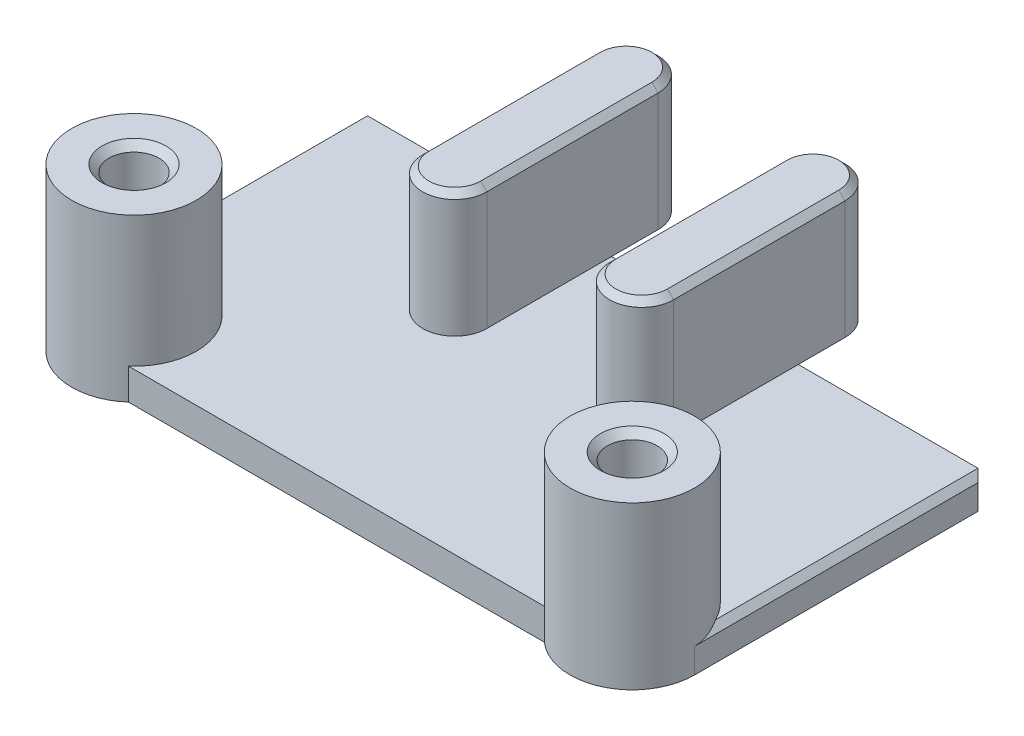
ISO-10303-21;
HEADER;
FILE_DESCRIPTION(('STEP AP214'),'2;1');
FILE_NAME('part.step','',(''),(''),'','','');
FILE_SCHEMA(('AUTOMOTIVE_DESIGN { 1 0 10303 214 1 1 1 1 }'));
ENDSEC;
DATA;
#1=APPLICATION_CONTEXT('core data for automotive mechanical design processes');
#2=APPLICATION_PROTOCOL_DEFINITION('international standard','automotive_design',2000,#1);
#3=PRODUCT_CONTEXT('',#1,'mechanical');
#4=PRODUCT('Part','Part','',(#3));
#5=PRODUCT_RELATED_PRODUCT_CATEGORY('part','',(#4));
#6=PRODUCT_DEFINITION_FORMATION('','',#4);
#7=PRODUCT_DEFINITION_CONTEXT('part definition',#1,'design');
#8=PRODUCT_DEFINITION('design','',#6,#7);
#9=PRODUCT_DEFINITION_SHAPE('','',#8);
#10=(LENGTH_UNIT() NAMED_UNIT(*) SI_UNIT(.MILLI.,.METRE.));
#11=(NAMED_UNIT(*) PLANE_ANGLE_UNIT() SI_UNIT($,.RADIAN.));
#12=(NAMED_UNIT(*) SI_UNIT($,.STERADIAN.) SOLID_ANGLE_UNIT());
#13=UNCERTAINTY_MEASURE_WITH_UNIT(LENGTH_MEASURE(1.E-05),#10,'distance_accuracy_value','');
#14=(GEOMETRIC_REPRESENTATION_CONTEXT(3) GLOBAL_UNCERTAINTY_ASSIGNED_CONTEXT((#13)) GLOBAL_UNIT_ASSIGNED_CONTEXT((#10,
#11,#12)) REPRESENTATION_CONTEXT('',''));
#15=CARTESIAN_POINT('',(0.,0.,0.));
#16=DIRECTION('',(0.,0.,1.));
#17=DIRECTION('',(1.,0.,0.));
#18=AXIS2_PLACEMENT_3D('',#15,#16,#17);
#19=CARTESIAN_POINT('',(0.,0.,0.));
#20=DIRECTION('',(0.,1.,0.));
#21=DIRECTION('',(0.,0.,1.));
#22=AXIS2_PLACEMENT_3D('',#19,#20,#21);
#23=PLANE('',#22);
#24=DIRECTION('',(0.,0.,1.));
#25=VECTOR('',#24,1.);
#26=CARTESIAN_POINT('',(-10.,0.,-5.4));
#27=LINE('',#26,#25);
#28=CARTESIAN_POINT('',(-10.,0.,-5.2));
#29=VERTEX_POINT('',#28);
#30=CARTESIAN_POINT('',(-10.,0.,3.9));
#31=VERTEX_POINT('',#30);
#32=EDGE_CURVE('E233',#29,#31,#27,.T.);
#33=ORIENTED_EDGE('',*,*,#32,.F.);
#34=DIRECTION('',(-0.707106781186548,0.,0.707106781186548));
#35=VECTOR('',#34,1.);
#36=CARTESIAN_POINT('',(-10.,0.,-5.2));
#37=LINE('',#36,#35);
#38=CARTESIAN_POINT('',(-9.8,0.,-5.4));
#39=VERTEX_POINT('',#38);
#40=EDGE_CURVE('E251',#29,#39,#37,.F.);
#41=ORIENTED_EDGE('',*,*,#40,.T.);
#42=DIRECTION('',(-1.,0.,0.));
#43=VECTOR('',#42,1.);
#44=CARTESIAN_POINT('',(-10.,0.,-5.4));
#45=LINE('',#44,#43);
#46=CARTESIAN_POINT('',(9.8,0.,-5.4));
#47=VERTEX_POINT('',#46);
#48=EDGE_CURVE('E229',#47,#39,#45,.T.);
#49=ORIENTED_EDGE('',*,*,#48,.F.);
#50=DIRECTION('',(-0.707106781186548,0.,-0.707106781186548));
#51=VECTOR('',#50,1.);
#52=CARTESIAN_POINT('',(9.8,0.,-5.4));
#53=LINE('',#52,#51);
#54=CARTESIAN_POINT('',(10.,0.,-5.2));
#55=VERTEX_POINT('',#54);
#56=EDGE_CURVE('E228',#47,#55,#53,.F.);
#57=ORIENTED_EDGE('',*,*,#56,.T.);
#58=DIRECTION('',(0.,0.,-1.));
#59=VECTOR('',#58,1.);
#60=CARTESIAN_POINT('',(10.,0.,-5.4));
#61=LINE('',#60,#59);
#62=CARTESIAN_POINT('',(10.,0.,3.89999999999999));
#63=VERTEX_POINT('',#62);
#64=EDGE_CURVE('E219',#63,#55,#61,.T.);
#65=ORIENTED_EDGE('',*,*,#64,.F.);
#66=CARTESIAN_POINT('',(8.,0.,3.9));
#67=DIRECTION('',(0.,1.,0.));
#68=DIRECTION('',(0.,0.,1.));
#69=AXIS2_PLACEMENT_3D('',#66,#67,#68);
#70=CIRCLE('',#69,2.);
#71=CARTESIAN_POINT('',(6.6771243444677,0.,5.4));
#72=VERTEX_POINT('',#71);
#73=EDGE_CURVE('E203',#72,#63,#70,.T.);
#74=ORIENTED_EDGE('',*,*,#73,.F.);
#75=DIRECTION('',(1.,0.,0.));
#76=VECTOR('',#75,1.);
#77=CARTESIAN_POINT('',(-10.,0.,5.4));
#78=LINE('',#77,#76);
#79=CARTESIAN_POINT('',(-6.67712434446771,0.,5.4));
#80=VERTEX_POINT('',#79);
#81=EDGE_CURVE('E242',#80,#72,#78,.T.);
#82=ORIENTED_EDGE('',*,*,#81,.F.);
#83=CARTESIAN_POINT('',(-8.,0.,3.9));
#84=DIRECTION('',(0.,1.,0.));
#85=DIRECTION('',(0.,0.,1.));
#86=AXIS2_PLACEMENT_3D('',#83,#84,#85);
#87=CIRCLE('',#86,2.);
#88=EDGE_CURVE('E800',#31,#80,#87,.T.);
#89=ORIENTED_EDGE('',*,*,#88,.F.);
#90=EDGE_LOOP('',(#33,#41,#49,#57,#65,#74,#82,#89));
#91=FACE_BOUND('',#90,.T.);
#92=ADVANCED_FACE('F40',(#91),#23,.F.);
#93=CARTESIAN_POINT('',(10.,1.,-5.4));
#94=DIRECTION('',(-1.,0.,0.));
#95=DIRECTION('',(0.,0.,1.));
#96=AXIS2_PLACEMENT_3D('',#93,#94,#95);
#97=PLANE('',#96);
#98=ORIENTED_EDGE('',*,*,#64,.T.);
#99=DIRECTION('',(0.,1.,0.));
#100=VECTOR('',#99,1.);
#101=CARTESIAN_POINT('',(10.,1.,-5.2));
#102=LINE('',#101,#100);
#103=CARTESIAN_POINT('',(10.,0.799999999999998,-5.2));
#104=VERTEX_POINT('',#103);
#105=EDGE_CURVE('E263',#55,#104,#102,.T.);
#106=ORIENTED_EDGE('',*,*,#105,.T.);
#107=DIRECTION('',(0.,0.,1.));
#108=VECTOR('',#107,1.);
#109=CARTESIAN_POINT('',(10.,0.799999999999998,3.9));
#110=LINE('',#109,#108);
#111=CARTESIAN_POINT('',(10.,0.799999999999998,3.89999999999999));
#112=VERTEX_POINT('',#111);
#113=EDGE_CURVE('E222',#104,#112,#110,.T.);
#114=ORIENTED_EDGE('',*,*,#113,.T.);
#115=DIRECTION('',(0.,1.,0.));
#116=VECTOR('',#115,1.);
#117=CARTESIAN_POINT('',(10.,0.,3.89999999999999));
#118=LINE('',#117,#116);
#119=EDGE_CURVE('E207',#63,#112,#118,.T.);
#120=ORIENTED_EDGE('',*,*,#119,.F.);
#121=EDGE_LOOP('',(#98,#106,#114,#120));
#122=FACE_BOUND('',#121,.T.);
#123=ADVANCED_FACE('F218',(#122),#97,.F.);
#124=CARTESIAN_POINT('',(0.,1.,0.));
#125=DIRECTION('',(0.,1.,0.));
#126=DIRECTION('',(0.,0.,1.));
#127=AXIS2_PLACEMENT_3D('',#124,#125,#126);
#128=PLANE('',#127);
#129=DIRECTION('',(-1.,0.,0.));
#130=VECTOR('',#129,1.);
#131=CARTESIAN_POINT('',(-10.,1.,-5.4));
#132=LINE('',#131,#130);
#133=CARTESIAN_POINT('',(-4.03,1.,-5.4));
#134=VERTEX_POINT('',#133);
#135=CARTESIAN_POINT('',(-9.8,1.,-5.4));
#136=VERTEX_POINT('',#135);
#137=EDGE_CURVE('E244',#134,#136,#132,.T.);
#138=ORIENTED_EDGE('',*,*,#137,.T.);
#139=DIRECTION('',(0.,0.,1.));
#140=VECTOR('',#139,1.);
#141=CARTESIAN_POINT('',(-9.8,1.,3.9));
#142=LINE('',#141,#140);
#143=CARTESIAN_POINT('',(-9.8,1.,3.02822021129186));
#144=VERTEX_POINT('',#143);
#145=EDGE_CURVE('E260',#136,#144,#142,.T.);
#146=ORIENTED_EDGE('',*,*,#145,.T.);
#147=CARTESIAN_POINT('',(-8.,1.,3.9));
#148=DIRECTION('',(0.,1.,0.));
#149=DIRECTION('',(0.,0.,1.));
#150=AXIS2_PLACEMENT_3D('',#147,#148,#149);
#151=CIRCLE('',#150,2.);
#152=CARTESIAN_POINT('',(-6.67712434446771,1.,5.4));
#153=VERTEX_POINT('',#152);
#154=EDGE_CURVE('E235',#153,#144,#151,.T.);
#155=ORIENTED_EDGE('',*,*,#154,.F.);
#156=DIRECTION('',(1.,0.,0.));
#157=VECTOR('',#156,1.);
#158=CARTESIAN_POINT('',(-10.,1.,5.4));
#159=LINE('',#158,#157);
#160=CARTESIAN_POINT('',(6.67712434446771,1.,5.4));
#161=VERTEX_POINT('',#160);
#162=EDGE_CURVE('E238',#153,#161,#159,.T.);
#163=ORIENTED_EDGE('',*,*,#162,.T.);
#164=CARTESIAN_POINT('',(8.,1.,3.9));
#165=DIRECTION('',(0.,1.,0.));
#166=DIRECTION('',(0.,0.,1.));
#167=AXIS2_PLACEMENT_3D('',#164,#165,#166);
#168=CIRCLE('',#167,2.);
#169=CARTESIAN_POINT('',(9.8,1.,3.02822021129186));
#170=VERTEX_POINT('',#169);
#171=EDGE_CURVE('E864',#170,#161,#168,.T.);
#172=ORIENTED_EDGE('',*,*,#171,.F.);
#173=DIRECTION('',(0.,0.,-1.));
#174=VECTOR('',#173,1.);
#175=CARTESIAN_POINT('',(9.8,1.,-5.4));
#176=LINE('',#175,#174);
#177=CARTESIAN_POINT('',(9.8,1.,-5.4));
#178=VERTEX_POINT('',#177);
#179=EDGE_CURVE('E258',#170,#178,#176,.T.);
#180=ORIENTED_EDGE('',*,*,#179,.T.);
#181=CARTESIAN_POINT('',(4.03,1.,-5.4));
#182=VERTEX_POINT('',#181);
#183=EDGE_CURVE('E869',#178,#182,#132,.T.);
#184=ORIENTED_EDGE('',*,*,#183,.T.);
#185=DIRECTION('',(0.,0.,1.));
#186=VECTOR('',#185,1.);
#187=CARTESIAN_POINT('',(4.03,1.,0.));
#188=LINE('',#187,#186);
#189=CARTESIAN_POINT('',(4.03,1.,-1.4));
#190=VERTEX_POINT('',#189);
#191=EDGE_CURVE('E832',#182,#190,#188,.T.);
#192=ORIENTED_EDGE('',*,*,#191,.T.);
#193=CARTESIAN_POINT('',(3.,1.,-1.4));
#194=DIRECTION('',(0.,1.,0.));
#195=DIRECTION('',(0.,0.,1.));
#196=AXIS2_PLACEMENT_3D('',#193,#194,#195);
#197=CIRCLE('',#196,1.03);
#198=CARTESIAN_POINT('',(1.97,1.,-1.4));
#199=VERTEX_POINT('',#198);
#200=EDGE_CURVE('E829',#199,#190,#197,.T.);
#201=ORIENTED_EDGE('',*,*,#200,.F.);
#202=DIRECTION('',(0.,0.,1.));
#203=VECTOR('',#202,1.);
#204=CARTESIAN_POINT('',(1.97,1.,0.));
#205=LINE('',#204,#203);
#206=CARTESIAN_POINT('',(1.97,1.,-5.4));
#207=VERTEX_POINT('',#206);
#208=EDGE_CURVE('E826',#207,#199,#205,.T.);
#209=ORIENTED_EDGE('',*,*,#208,.F.);
#210=CARTESIAN_POINT('',(-1.97,1.,-5.4));
#211=VERTEX_POINT('',#210);
#212=EDGE_CURVE('E870',#207,#211,#132,.T.);
#213=ORIENTED_EDGE('',*,*,#212,.T.);
#214=DIRECTION('',(0.,0.,1.));
#215=VECTOR('',#214,1.);
#216=CARTESIAN_POINT('',(-1.97,1.,0.));
#217=LINE('',#216,#215);
#218=CARTESIAN_POINT('',(-1.97,1.,-1.4));
#219=VERTEX_POINT('',#218);
#220=EDGE_CURVE('E847',#211,#219,#217,.T.);
#221=ORIENTED_EDGE('',*,*,#220,.T.);
#222=CARTESIAN_POINT('',(-3.,1.,-1.4));
#223=DIRECTION('',(0.,1.,0.));
#224=DIRECTION('',(0.,0.,1.));
#225=AXIS2_PLACEMENT_3D('',#222,#223,#224);
#226=CIRCLE('',#225,1.03);
#227=CARTESIAN_POINT('',(-4.03,1.,-1.4));
#228=VERTEX_POINT('',#227);
#229=EDGE_CURVE('E844',#228,#219,#226,.T.);
#230=ORIENTED_EDGE('',*,*,#229,.F.);
#231=DIRECTION('',(0.,0.,1.));
#232=VECTOR('',#231,1.);
#233=CARTESIAN_POINT('',(-4.03,1.,0.));
#234=LINE('',#233,#232);
#235=EDGE_CURVE('E787',#134,#228,#234,.T.);
#236=ORIENTED_EDGE('',*,*,#235,.F.);
#237=EDGE_LOOP('',(#138,#146,#155,#163,#172,#180,#184,#192,#201,#209,#213,#221,#230,#236));
#238=FACE_BOUND('',#237,.T.);
#239=ADVANCED_FACE('F374',(#238),#128,.T.);
#240=CARTESIAN_POINT('',(-10.,1.,5.4));
#241=DIRECTION('',(0.,0.,-1.));
#242=DIRECTION('',(-1.,0.,0.));
#243=AXIS2_PLACEMENT_3D('',#240,#241,#242);
#244=PLANE('',#243);
#245=ORIENTED_EDGE('',*,*,#81,.T.);
#246=DIRECTION('',(0.,1.,0.));
#247=VECTOR('',#246,1.);
#248=CARTESIAN_POINT('',(6.6771243444677,0.,5.4));
#249=LINE('',#248,#247);
#250=EDGE_CURVE('E210',#72,#161,#249,.T.);
#251=ORIENTED_EDGE('',*,*,#250,.T.);
#252=ORIENTED_EDGE('',*,*,#162,.F.);
#253=DIRECTION('',(0.,1.,0.));
#254=VECTOR('',#253,1.);
#255=CARTESIAN_POINT('',(-6.67712434446771,0.,5.4));
#256=LINE('',#255,#254);
#257=EDGE_CURVE('E230',#153,#80,#256,.F.);
#258=ORIENTED_EDGE('',*,*,#257,.T.);
#259=EDGE_LOOP('',(#245,#251,#252,#258));
#260=FACE_BOUND('',#259,.T.);
#261=ADVANCED_FACE('F379',(#260),#244,.F.);
#262=CARTESIAN_POINT('',(-10.,1.,-5.4));
#263=DIRECTION('',(0.,0.,1.));
#264=DIRECTION('',(1.,0.,0.));
#265=AXIS2_PLACEMENT_3D('',#262,#263,#264);
#266=PLANE('',#265);
#267=ORIENTED_EDGE('',*,*,#48,.T.);
#268=DIRECTION('',(0.,1.,0.));
#269=VECTOR('',#268,1.);
#270=CARTESIAN_POINT('',(-9.8,1.,-5.4));
#271=LINE('',#270,#269);
#272=EDGE_CURVE('E256',#39,#136,#271,.T.);
#273=ORIENTED_EDGE('',*,*,#272,.T.);
#274=ORIENTED_EDGE('',*,*,#137,.F.);
#275=EDGE_CURVE('E790',#211,#134,#132,.T.);
#276=ORIENTED_EDGE('',*,*,#275,.F.);
#277=ORIENTED_EDGE('',*,*,#212,.F.);
#278=EDGE_CURVE('E791',#182,#207,#132,.T.);
#279=ORIENTED_EDGE('',*,*,#278,.F.);
#280=ORIENTED_EDGE('',*,*,#183,.F.);
#281=DIRECTION('',(0.,-1.,0.));
#282=VECTOR('',#281,1.);
#283=CARTESIAN_POINT('',(9.8,1.,-5.4));
#284=LINE('',#283,#282);
#285=EDGE_CURVE('E253',#178,#47,#284,.T.);
#286=ORIENTED_EDGE('',*,*,#285,.T.);
#287=EDGE_LOOP('',(#267,#273,#274,#276,#277,#279,#280,#286));
#288=FACE_BOUND('',#287,.T.);
#289=ADVANCED_FACE('F382',(#288),#266,.F.);
#290=CARTESIAN_POINT('',(-10.,1.,-5.4));
#291=DIRECTION('',(1.,0.,0.));
#292=DIRECTION('',(0.,0.,-1.));
#293=AXIS2_PLACEMENT_3D('',#290,#291,#292);
#294=PLANE('',#293);
#295=DIRECTION('',(0.,0.,-1.));
#296=VECTOR('',#295,1.);
#297=CARTESIAN_POINT('',(-10.,0.799999999999998,-5.4));
#298=LINE('',#297,#296);
#299=CARTESIAN_POINT('',(-10.,0.799999999999998,3.9));
#300=VERTEX_POINT('',#299);
#301=CARTESIAN_POINT('',(-10.,0.799999999999998,-5.2));
#302=VERTEX_POINT('',#301);
#303=EDGE_CURVE('E245',#300,#302,#298,.T.);
#304=ORIENTED_EDGE('',*,*,#303,.T.);
#305=DIRECTION('',(0.,-1.,0.));
#306=VECTOR('',#305,1.);
#307=CARTESIAN_POINT('',(-10.,1.,-5.2));
#308=LINE('',#307,#306);
#309=EDGE_CURVE('E247',#302,#29,#308,.T.);
#310=ORIENTED_EDGE('',*,*,#309,.T.);
#311=ORIENTED_EDGE('',*,*,#32,.T.);
#312=DIRECTION('',(0.,1.,0.));
#313=VECTOR('',#312,1.);
#314=CARTESIAN_POINT('',(-10.,0.,3.9));
#315=LINE('',#314,#313);
#316=EDGE_CURVE('E223',#31,#300,#315,.T.);
#317=ORIENTED_EDGE('',*,*,#316,.T.);
#318=EDGE_LOOP('',(#304,#310,#311,#317));
#319=FACE_BOUND('',#318,.T.);
#320=ADVANCED_FACE('F384',(#319),#294,.F.);
#321=CARTESIAN_POINT('',(-8.,0.,3.9));
#322=DIRECTION('',(0.,1.,0.));
#323=DIRECTION('',(0.,0.,1.));
#324=AXIS2_PLACEMENT_3D('',#321,#322,#323);
#325=CYLINDRICAL_SURFACE('',#324,2.);
#326=CARTESIAN_POINT('',(-8.,5.2,3.9));
#327=DIRECTION('',(0.,1.,0.));
#328=DIRECTION('',(0.,0.,1.));
#329=AXIS2_PLACEMENT_3D('',#326,#327,#328);
#330=CIRCLE('',#329,2.);
#331=CARTESIAN_POINT('',(-8.,5.2,5.9));
#332=VERTEX_POINT('',#331);
#333=EDGE_CURVE('E804',#332,#332,#330,.T.);
#334=ORIENTED_EDGE('',*,*,#333,.F.);
#335=EDGE_LOOP('',(#334));
#336=FACE_BOUND('',#335,.T.);
#337=ORIENTED_EDGE('',*,*,#316,.F.);
#338=ORIENTED_EDGE('',*,*,#88,.T.);
#339=ORIENTED_EDGE('',*,*,#257,.F.);
#340=ORIENTED_EDGE('',*,*,#154,.T.);
#341=CARTESIAN_POINT('',(-8.,2.79999999999999,3.9));
#342=DIRECTION('',(-0.707106781186546,0.707106781186549,0.));
#343=DIRECTION('',(0.707106781186549,0.707106781186546,0.));
#344=AXIS2_PLACEMENT_3D('',#341,#342,#343);
#345=ELLIPSE('',#344,2.82842712474618,2.);
#346=EDGE_CURVE('E265',#144,#300,#345,.T.);
#347=ORIENTED_EDGE('',*,*,#346,.T.);
#348=EDGE_LOOP('',(#337,#338,#339,#340,#347));
#349=FACE_BOUND('',#348,.T.);
#350=ADVANCED_FACE('F387',(#336,#349),#325,.T.);
#351=CARTESIAN_POINT('',(-8.,5.2,3.9));
#352=DIRECTION('',(0.,1.,0.));
#353=DIRECTION('',(0.,0.,1.));
#354=AXIS2_PLACEMENT_3D('',#351,#352,#353);
#355=PLANE('',#354);
#356=CARTESIAN_POINT('',(-8.,5.2,3.9));
#357=DIRECTION('',(0.,1.,0.));
#358=DIRECTION('',(0.,0.,1.));
#359=AXIS2_PLACEMENT_3D('',#356,#357,#358);
#360=CIRCLE('',#359,1.025);
#361=CARTESIAN_POINT('',(-8.,5.2,4.925));
#362=VERTEX_POINT('',#361);
#363=EDGE_CURVE('E806',#362,#362,#360,.T.);
#364=ORIENTED_EDGE('',*,*,#363,.F.);
#365=EDGE_LOOP('',(#364));
#366=FACE_BOUND('',#365,.T.);
#367=ORIENTED_EDGE('',*,*,#333,.T.);
#368=EDGE_LOOP('',(#367));
#369=FACE_BOUND('',#368,.T.);
#370=ADVANCED_FACE('F560',(#366,#369),#355,.T.);
#371=CARTESIAN_POINT('',(8.,0.,3.9));
#372=DIRECTION('',(0.,1.,0.));
#373=DIRECTION('',(0.,0.,1.));
#374=AXIS2_PLACEMENT_3D('',#371,#372,#373);
#375=CYLINDRICAL_SURFACE('',#374,2.);
#376=ORIENTED_EDGE('',*,*,#73,.T.);
#377=ORIENTED_EDGE('',*,*,#119,.T.);
#378=CARTESIAN_POINT('',(8.,2.8,3.9));
#379=DIRECTION('',(0.707106781186547,0.707106781186547,0.));
#380=DIRECTION('',(-0.707106781186548,0.707106781186548,0.));
#381=AXIS2_PLACEMENT_3D('',#378,#379,#380);
#382=ELLIPSE('',#381,2.82842712474619,2.);
#383=EDGE_CURVE('E267',#112,#170,#382,.T.);
#384=ORIENTED_EDGE('',*,*,#383,.T.);
#385=ORIENTED_EDGE('',*,*,#171,.T.);
#386=ORIENTED_EDGE('',*,*,#250,.F.);
#387=EDGE_LOOP('',(#376,#377,#384,#385,#386));
#388=FACE_BOUND('',#387,.T.);
#389=CARTESIAN_POINT('',(8.,5.2,3.9));
#390=DIRECTION('',(0.,1.,0.));
#391=DIRECTION('',(0.,0.,1.));
#392=AXIS2_PLACEMENT_3D('',#389,#390,#391);
#393=CIRCLE('',#392,2.);
#394=CARTESIAN_POINT('',(8.,5.2,5.9));
#395=VERTEX_POINT('',#394);
#396=EDGE_CURVE('E214',#395,#395,#393,.T.);
#397=ORIENTED_EDGE('',*,*,#396,.F.);
#398=EDGE_LOOP('',(#397));
#399=FACE_BOUND('',#398,.T.);
#400=ADVANCED_FACE('F205',(#388,#399),#375,.T.);
#401=CARTESIAN_POINT('',(8.,5.2,3.9));
#402=DIRECTION('',(0.,1.,0.));
#403=DIRECTION('',(0.,0.,1.));
#404=AXIS2_PLACEMENT_3D('',#401,#402,#403);
#405=PLANE('',#404);
#406=CARTESIAN_POINT('',(8.,5.2,3.9));
#407=DIRECTION('',(0.,1.,0.));
#408=DIRECTION('',(0.,0.,1.));
#409=AXIS2_PLACEMENT_3D('',#406,#407,#408);
#410=CIRCLE('',#409,1.025);
#411=CARTESIAN_POINT('',(8.,5.2,4.925));
#412=VERTEX_POINT('',#411);
#413=EDGE_CURVE('E817',#412,#412,#410,.T.);
#414=ORIENTED_EDGE('',*,*,#413,.F.);
#415=EDGE_LOOP('',(#414));
#416=FACE_BOUND('',#415,.T.);
#417=ORIENTED_EDGE('',*,*,#396,.T.);
#418=EDGE_LOOP('',(#417));
#419=FACE_BOUND('',#418,.T.);
#420=ADVANCED_FACE('F519',(#416,#419),#405,.T.);
#421=CARTESIAN_POINT('',(0.,1.,0.));
#422=DIRECTION('',(0.,1.,0.));
#423=DIRECTION('',(0.,0.,1.));
#424=AXIS2_PLACEMENT_3D('',#421,#422,#423);
#425=PLANE('',#424);
#426=CARTESIAN_POINT('',(-1.97,1.,-6.9));
#427=VERTEX_POINT('',#426);
#428=EDGE_CURVE('E848',#427,#211,#217,.T.);
#429=ORIENTED_EDGE('',*,*,#428,.T.);
#430=ORIENTED_EDGE('',*,*,#275,.T.);
#431=CARTESIAN_POINT('',(-4.03,1.,-6.9));
#432=VERTEX_POINT('',#431);
#433=EDGE_CURVE('E841',#432,#134,#234,.T.);
#434=ORIENTED_EDGE('',*,*,#433,.F.);
#435=CARTESIAN_POINT('',(-3.,1.,-6.9));
#436=DIRECTION('',(0.,1.,0.));
#437=DIRECTION('',(0.,0.,1.));
#438=AXIS2_PLACEMENT_3D('',#435,#436,#437);
#439=CIRCLE('',#438,1.03);
#440=EDGE_CURVE('E851',#427,#432,#439,.T.);
#441=ORIENTED_EDGE('',*,*,#440,.F.);
#442=EDGE_LOOP('',(#429,#430,#434,#441));
#443=FACE_BOUND('',#442,.T.);
#444=ADVANCED_FACE('F615',(#443),#425,.F.);
#445=CARTESIAN_POINT('',(-4.03,5.,0.));
#446=DIRECTION('',(1.,0.,0.));
#447=DIRECTION('',(0.,0.,-1.));
#448=AXIS2_PLACEMENT_3D('',#445,#446,#447);
#449=PLANE('',#448);
#450=DIRECTION('',(0.,-1.,0.));
#451=VECTOR('',#450,1.);
#452=CARTESIAN_POINT('',(-4.03,5.,-1.4));
#453=LINE('',#452,#451);
#454=CARTESIAN_POINT('',(-4.03,4.8,-1.4));
#455=VERTEX_POINT('',#454);
#456=EDGE_CURVE('E860',#455,#228,#453,.T.);
#457=ORIENTED_EDGE('',*,*,#456,.F.);
#458=DIRECTION('',(0.,0.,-1.));
#459=VECTOR('',#458,1.);
#460=CARTESIAN_POINT('',(-4.03,4.8,-6.9));
#461=LINE('',#460,#459);
#462=CARTESIAN_POINT('',(-4.03,4.8,-6.9));
#463=VERTEX_POINT('',#462);
#464=EDGE_CURVE('E291',#455,#463,#461,.T.);
#465=ORIENTED_EDGE('',*,*,#464,.T.);
#466=DIRECTION('',(0.,-1.,0.));
#467=VECTOR('',#466,1.);
#468=CARTESIAN_POINT('',(-4.03,5.,-6.9));
#469=LINE('',#468,#467);
#470=EDGE_CURVE('E854',#463,#432,#469,.T.);
#471=ORIENTED_EDGE('',*,*,#470,.T.);
#472=ORIENTED_EDGE('',*,*,#433,.T.);
#473=ORIENTED_EDGE('',*,*,#235,.T.);
#474=EDGE_LOOP('',(#457,#465,#471,#472,#473));
#475=FACE_BOUND('',#474,.T.);
#476=ADVANCED_FACE('F621',(#475),#449,.F.);
#477=CARTESIAN_POINT('',(-3.,5.,-1.4));
#478=DIRECTION('',(0.,-1.,0.));
#479=DIRECTION('',(0.,0.,-1.));
#480=AXIS2_PLACEMENT_3D('',#477,#478,#479);
#481=CYLINDRICAL_SURFACE('',#480,1.03);
#482=DIRECTION('',(0.,-1.,0.));
#483=VECTOR('',#482,1.);
#484=CARTESIAN_POINT('',(-1.97,5.,-1.4));
#485=LINE('',#484,#483);
#486=CARTESIAN_POINT('',(-1.97,4.8,-1.4));
#487=VERTEX_POINT('',#486);
#488=EDGE_CURVE('E858',#487,#219,#485,.T.);
#489=ORIENTED_EDGE('',*,*,#488,.F.);
#490=CARTESIAN_POINT('',(-3.,4.8,-1.4));
#491=DIRECTION('',(0.,1.,0.));
#492=DIRECTION('',(0.,0.,1.));
#493=AXIS2_PLACEMENT_3D('',#490,#491,#492);
#494=CIRCLE('',#493,1.03);
#495=EDGE_CURVE('E289',#487,#455,#494,.F.);
#496=ORIENTED_EDGE('',*,*,#495,.T.);
#497=ORIENTED_EDGE('',*,*,#456,.T.);
#498=ORIENTED_EDGE('',*,*,#229,.T.);
#499=EDGE_LOOP('',(#489,#496,#497,#498));
#500=FACE_BOUND('',#499,.T.);
#501=ADVANCED_FACE('F630',(#500),#481,.T.);
#502=CARTESIAN_POINT('',(-1.97,5.,0.));
#503=DIRECTION('',(1.,0.,0.));
#504=DIRECTION('',(0.,0.,-1.));
#505=AXIS2_PLACEMENT_3D('',#502,#503,#504);
#506=PLANE('',#505);
#507=DIRECTION('',(0.,-1.,0.));
#508=VECTOR('',#507,1.);
#509=CARTESIAN_POINT('',(-1.97,5.,-6.9));
#510=LINE('',#509,#508);
#511=CARTESIAN_POINT('',(-1.97,4.8,-6.9));
#512=VERTEX_POINT('',#511);
#513=EDGE_CURVE('E856',#512,#427,#510,.T.);
#514=ORIENTED_EDGE('',*,*,#513,.F.);
#515=DIRECTION('',(0.,0.,1.));
#516=VECTOR('',#515,1.);
#517=CARTESIAN_POINT('',(-1.97,4.8,0.));
#518=LINE('',#517,#516);
#519=EDGE_CURVE('E287',#512,#487,#518,.T.);
#520=ORIENTED_EDGE('',*,*,#519,.T.);
#521=ORIENTED_EDGE('',*,*,#488,.T.);
#522=ORIENTED_EDGE('',*,*,#220,.F.);
#523=ORIENTED_EDGE('',*,*,#428,.F.);
#524=EDGE_LOOP('',(#514,#520,#521,#522,#523));
#525=FACE_BOUND('',#524,.T.);
#526=ADVANCED_FACE('F638',(#525),#506,.T.);
#527=CARTESIAN_POINT('',(-3.,5.,-6.9));
#528=DIRECTION('',(0.,-1.,0.));
#529=DIRECTION('',(0.,0.,-1.));
#530=AXIS2_PLACEMENT_3D('',#527,#528,#529);
#531=CYLINDRICAL_SURFACE('',#530,1.03);
#532=ORIENTED_EDGE('',*,*,#470,.F.);
#533=CARTESIAN_POINT('',(-3.,4.8,-6.9));
#534=DIRECTION('',(0.,1.,0.));
#535=DIRECTION('',(0.,0.,1.));
#536=AXIS2_PLACEMENT_3D('',#533,#534,#535);
#537=CIRCLE('',#536,1.03);
#538=EDGE_CURVE('E284',#463,#512,#537,.F.);
#539=ORIENTED_EDGE('',*,*,#538,.T.);
#540=ORIENTED_EDGE('',*,*,#513,.T.);
#541=ORIENTED_EDGE('',*,*,#440,.T.);
#542=EDGE_LOOP('',(#532,#539,#540,#541));
#543=FACE_BOUND('',#542,.T.);
#544=ADVANCED_FACE('F646',(#543),#531,.T.);
#545=CARTESIAN_POINT('',(0.,5.,0.));
#546=DIRECTION('',(0.,1.,0.));
#547=DIRECTION('',(0.,0.,1.));
#548=AXIS2_PLACEMENT_3D('',#545,#546,#547);
#549=PLANE('',#548);
#550=DIRECTION('',(0.,0.,-1.));
#551=VECTOR('',#550,1.);
#552=CARTESIAN_POINT('',(-2.17,5.,0.));
#553=LINE('',#552,#551);
#554=CARTESIAN_POINT('',(-2.17,5.,-1.4));
#555=VERTEX_POINT('',#554);
#556=CARTESIAN_POINT('',(-2.17,5.,-6.9));
#557=VERTEX_POINT('',#556);
#558=EDGE_CURVE('E279',#555,#557,#553,.T.);
#559=ORIENTED_EDGE('',*,*,#558,.T.);
#560=CARTESIAN_POINT('',(-3.,5.,-6.9));
#561=DIRECTION('',(0.,1.,0.));
#562=DIRECTION('',(0.,0.,1.));
#563=AXIS2_PLACEMENT_3D('',#560,#561,#562);
#564=CIRCLE('',#563,0.830000000000004);
#565=CARTESIAN_POINT('',(-3.83000000000001,5.,-6.9));
#566=VERTEX_POINT('',#565);
#567=EDGE_CURVE('E281',#557,#566,#564,.T.);
#568=ORIENTED_EDGE('',*,*,#567,.T.);
#569=DIRECTION('',(0.,0.,1.));
#570=VECTOR('',#569,1.);
#571=CARTESIAN_POINT('',(-3.83000000000001,5.,-1.4));
#572=LINE('',#571,#570);
#573=CARTESIAN_POINT('',(-3.83000000000001,5.,-1.4));
#574=VERTEX_POINT('',#573);
#575=EDGE_CURVE('E269',#566,#574,#572,.T.);
#576=ORIENTED_EDGE('',*,*,#575,.T.);
#577=CARTESIAN_POINT('',(-3.,5.,-1.4));
#578=DIRECTION('',(0.,1.,0.));
#579=DIRECTION('',(0.,0.,1.));
#580=AXIS2_PLACEMENT_3D('',#577,#578,#579);
#581=CIRCLE('',#580,0.830000000000005);
#582=EDGE_CURVE('E277',#574,#555,#581,.T.);
#583=ORIENTED_EDGE('',*,*,#582,.T.);
#584=EDGE_LOOP('',(#559,#568,#576,#583));
#585=FACE_BOUND('',#584,.T.);
#586=ADVANCED_FACE('F654',(#585),#549,.T.);
#587=CARTESIAN_POINT('',(0.,1.,0.));
#588=DIRECTION('',(0.,1.,0.));
#589=DIRECTION('',(0.,0.,1.));
#590=AXIS2_PLACEMENT_3D('',#587,#588,#589);
#591=PLANE('',#590);
#592=CARTESIAN_POINT('',(4.03,1.,-6.9));
#593=VERTEX_POINT('',#592);
#594=EDGE_CURVE('E833',#593,#182,#188,.T.);
#595=ORIENTED_EDGE('',*,*,#594,.T.);
#596=ORIENTED_EDGE('',*,*,#278,.T.);
#597=CARTESIAN_POINT('',(1.97,1.,-6.9));
#598=VERTEX_POINT('',#597);
#599=EDGE_CURVE('E827',#598,#207,#205,.T.);
#600=ORIENTED_EDGE('',*,*,#599,.F.);
#601=CARTESIAN_POINT('',(3.,1.,-6.9));
#602=DIRECTION('',(0.,1.,0.));
#603=DIRECTION('',(0.,0.,1.));
#604=AXIS2_PLACEMENT_3D('',#601,#602,#603);
#605=CIRCLE('',#604,1.03);
#606=EDGE_CURVE('E347',#593,#598,#605,.T.);
#607=ORIENTED_EDGE('',*,*,#606,.F.);
#608=EDGE_LOOP('',(#595,#596,#600,#607));
#609=FACE_BOUND('',#608,.T.);
#610=ADVANCED_FACE('F662',(#609),#591,.F.);
#611=CARTESIAN_POINT('',(1.97,5.,0.));
#612=DIRECTION('',(1.,0.,0.));
#613=DIRECTION('',(0.,0.,-1.));
#614=AXIS2_PLACEMENT_3D('',#611,#612,#613);
#615=PLANE('',#614);
#616=DIRECTION('',(0.,-1.,0.));
#617=VECTOR('',#616,1.);
#618=CARTESIAN_POINT('',(1.97,5.,-1.4));
#619=LINE('',#618,#617);
#620=CARTESIAN_POINT('',(1.97,4.8,-1.4));
#621=VERTEX_POINT('',#620);
#622=EDGE_CURVE('E342',#621,#199,#619,.T.);
#623=ORIENTED_EDGE('',*,*,#622,.F.);
#624=DIRECTION('',(0.,0.,-1.));
#625=VECTOR('',#624,1.);
#626=CARTESIAN_POINT('',(1.97,4.8,-6.9));
#627=LINE('',#626,#625);
#628=CARTESIAN_POINT('',(1.97,4.8,-6.9));
#629=VERTEX_POINT('',#628);
#630=EDGE_CURVE('E11',#621,#629,#627,.T.);
#631=ORIENTED_EDGE('',*,*,#630,.T.);
#632=DIRECTION('',(0.,-1.,0.));
#633=VECTOR('',#632,1.);
#634=CARTESIAN_POINT('',(1.97,5.,-6.9));
#635=LINE('',#634,#633);
#636=EDGE_CURVE('E339',#629,#598,#635,.T.);
#637=ORIENTED_EDGE('',*,*,#636,.T.);
#638=ORIENTED_EDGE('',*,*,#599,.T.);
#639=ORIENTED_EDGE('',*,*,#208,.T.);
#640=EDGE_LOOP('',(#623,#631,#637,#638,#639));
#641=FACE_BOUND('',#640,.T.);
#642=ADVANCED_FACE('F337',(#641),#615,.F.);
#643=CARTESIAN_POINT('',(3.,5.,-1.4));
#644=DIRECTION('',(0.,-1.,0.));
#645=DIRECTION('',(0.,0.,-1.));
#646=AXIS2_PLACEMENT_3D('',#643,#644,#645);
#647=CYLINDRICAL_SURFACE('',#646,1.03);
#648=DIRECTION('',(0.,-1.,0.));
#649=VECTOR('',#648,1.);
#650=CARTESIAN_POINT('',(4.03,5.,-1.4));
#651=LINE('',#650,#649);
#652=CARTESIAN_POINT('',(4.03,4.8,-1.4));
#653=VERTEX_POINT('',#652);
#654=EDGE_CURVE('E838',#653,#190,#651,.T.);
#655=ORIENTED_EDGE('',*,*,#654,.F.);
#656=CARTESIAN_POINT('',(3.,4.8,-1.4));
#657=DIRECTION('',(0.,1.,0.));
#658=DIRECTION('',(0.,0.,1.));
#659=AXIS2_PLACEMENT_3D('',#656,#657,#658);
#660=CIRCLE('',#659,1.03);
#661=EDGE_CURVE('E49',#653,#621,#660,.F.);
#662=ORIENTED_EDGE('',*,*,#661,.T.);
#663=ORIENTED_EDGE('',*,*,#622,.T.);
#664=ORIENTED_EDGE('',*,*,#200,.T.);
#665=EDGE_LOOP('',(#655,#662,#663,#664));
#666=FACE_BOUND('',#665,.T.);
#667=ADVANCED_FACE('F675',(#666),#647,.T.);
#668=CARTESIAN_POINT('',(4.03,5.,0.));
#669=DIRECTION('',(1.,0.,0.));
#670=DIRECTION('',(0.,0.,-1.));
#671=AXIS2_PLACEMENT_3D('',#668,#669,#670);
#672=PLANE('',#671);
#673=DIRECTION('',(0.,-1.,0.));
#674=VECTOR('',#673,1.);
#675=CARTESIAN_POINT('',(4.03,5.,-6.9));
#676=LINE('',#675,#674);
#677=CARTESIAN_POINT('',(4.03,4.8,-6.9));
#678=VERTEX_POINT('',#677);
#679=EDGE_CURVE('E349',#678,#593,#676,.T.);
#680=ORIENTED_EDGE('',*,*,#679,.F.);
#681=DIRECTION('',(0.,0.,1.));
#682=VECTOR('',#681,1.);
#683=CARTESIAN_POINT('',(4.03,4.8,0.));
#684=LINE('',#683,#682);
#685=EDGE_CURVE('E64',#678,#653,#684,.T.);
#686=ORIENTED_EDGE('',*,*,#685,.T.);
#687=ORIENTED_EDGE('',*,*,#654,.T.);
#688=ORIENTED_EDGE('',*,*,#191,.F.);
#689=ORIENTED_EDGE('',*,*,#594,.F.);
#690=EDGE_LOOP('',(#680,#686,#687,#688,#689));
#691=FACE_BOUND('',#690,.T.);
#692=ADVANCED_FACE('F366',(#691),#672,.T.);
#693=CARTESIAN_POINT('',(3.,5.,-6.9));
#694=DIRECTION('',(0.,-1.,0.));
#695=DIRECTION('',(0.,0.,-1.));
#696=AXIS2_PLACEMENT_3D('',#693,#694,#695);
#697=CYLINDRICAL_SURFACE('',#696,1.03);
#698=ORIENTED_EDGE('',*,*,#636,.F.);
#699=CARTESIAN_POINT('',(3.,4.8,-6.9));
#700=DIRECTION('',(0.,1.,0.));
#701=DIRECTION('',(0.,0.,1.));
#702=AXIS2_PLACEMENT_3D('',#699,#700,#701);
#703=CIRCLE('',#702,1.03);
#704=EDGE_CURVE('E302',#629,#678,#703,.F.);
#705=ORIENTED_EDGE('',*,*,#704,.T.);
#706=ORIENTED_EDGE('',*,*,#679,.T.);
#707=ORIENTED_EDGE('',*,*,#606,.T.);
#708=EDGE_LOOP('',(#698,#705,#706,#707));
#709=FACE_BOUND('',#708,.T.);
#710=ADVANCED_FACE('F345',(#709),#697,.T.);
#711=CARTESIAN_POINT('',(0.,5.,0.));
#712=DIRECTION('',(0.,1.,0.));
#713=DIRECTION('',(0.,0.,1.));
#714=AXIS2_PLACEMENT_3D('',#711,#712,#713);
#715=PLANE('',#714);
#716=DIRECTION('',(0.,0.,-1.));
#717=VECTOR('',#716,1.);
#718=CARTESIAN_POINT('',(3.83,5.,0.));
#719=LINE('',#718,#717);
#720=CARTESIAN_POINT('',(3.83,5.,-1.4));
#721=VERTEX_POINT('',#720);
#722=CARTESIAN_POINT('',(3.83,5.,-6.9));
#723=VERTEX_POINT('',#722);
#724=EDGE_CURVE('E297',#721,#723,#719,.T.);
#725=ORIENTED_EDGE('',*,*,#724,.T.);
#726=CARTESIAN_POINT('',(3.,5.,-6.9));
#727=DIRECTION('',(0.,1.,0.));
#728=DIRECTION('',(0.,0.,1.));
#729=AXIS2_PLACEMENT_3D('',#726,#727,#728);
#730=CIRCLE('',#729,0.830000000000004);
#731=CARTESIAN_POINT('',(2.16999999999999,5.,-6.9));
#732=VERTEX_POINT('',#731);
#733=EDGE_CURVE('E299',#723,#732,#730,.T.);
#734=ORIENTED_EDGE('',*,*,#733,.T.);
#735=DIRECTION('',(0.,0.,1.));
#736=VECTOR('',#735,1.);
#737=CARTESIAN_POINT('',(2.17,5.,-1.4));
#738=LINE('',#737,#736);
#739=CARTESIAN_POINT('',(2.17,5.,-1.4));
#740=VERTEX_POINT('',#739);
#741=EDGE_CURVE('E293',#732,#740,#738,.T.);
#742=ORIENTED_EDGE('',*,*,#741,.T.);
#743=CARTESIAN_POINT('',(3.,5.,-1.4));
#744=DIRECTION('',(0.,1.,0.));
#745=DIRECTION('',(0.,0.,1.));
#746=AXIS2_PLACEMENT_3D('',#743,#744,#745);
#747=CIRCLE('',#746,0.830000000000006);
#748=EDGE_CURVE('E295',#740,#721,#747,.T.);
#749=ORIENTED_EDGE('',*,*,#748,.T.);
#750=EDGE_LOOP('',(#725,#734,#742,#749));
#751=FACE_BOUND('',#750,.T.);
#752=ADVANCED_FACE('F355',(#751),#715,.T.);
#753=CARTESIAN_POINT('',(8.,1.2,3.9));
#754=DIRECTION('',(0.,1.,0.));
#755=DIRECTION('',(0.,0.,1.));
#756=AXIS2_PLACEMENT_3D('',#753,#754,#755);
#757=CONICAL_SURFACE('',#756,0.799999999999999,1.02974425867665);
#758=CARTESIAN_POINT('',(8.,0.719311504777952,3.9));
#759=VERTEX_POINT('',#758);
#760=VERTEX_LOOP('',#759);
#761=FACE_BOUND('',#760,.T.);
#762=CARTESIAN_POINT('',(8.,1.2,3.9));
#763=DIRECTION('',(0.,1.,0.));
#764=DIRECTION('',(0.,0.,1.));
#765=AXIS2_PLACEMENT_3D('',#762,#763,#764);
#766=CIRCLE('',#765,0.799999999999999);
#767=CARTESIAN_POINT('',(8.,1.2,4.7));
#768=VERTEX_POINT('',#767);
#769=EDGE_CURVE('E823',#768,#768,#766,.T.);
#770=ORIENTED_EDGE('',*,*,#769,.T.);
#771=EDGE_LOOP('',(#770));
#772=FACE_BOUND('',#771,.T.);
#773=ADVANCED_FACE('F357',(#761,#772),#757,.F.);
#774=CARTESIAN_POINT('',(8.,5.2,3.9));
#775=DIRECTION('',(0.,1.,0.));
#776=DIRECTION('',(0.,0.,1.));
#777=AXIS2_PLACEMENT_3D('',#774,#775,#776);
#778=CYLINDRICAL_SURFACE('',#777,0.799999999999994);
#779=ORIENTED_EDGE('',*,*,#769,.F.);
#780=EDGE_LOOP('',(#779));
#781=FACE_BOUND('',#780,.T.);
#782=CARTESIAN_POINT('',(8.,4.975,3.9));
#783=DIRECTION('',(0.,1.,0.));
#784=DIRECTION('',(0.,0.,1.));
#785=AXIS2_PLACEMENT_3D('',#782,#783,#784);
#786=CIRCLE('',#785,0.79999999999999);
#787=CARTESIAN_POINT('',(8.,4.975,4.69999999999999));
#788=VERTEX_POINT('',#787);
#789=EDGE_CURVE('E820',#788,#788,#786,.T.);
#790=ORIENTED_EDGE('',*,*,#789,.T.);
#791=EDGE_LOOP('',(#790));
#792=FACE_BOUND('',#791,.T.);
#793=ADVANCED_FACE('F363',(#781,#792),#778,.F.);
#794=CARTESIAN_POINT('',(8.,5.2,3.9));
#795=DIRECTION('',(0.,1.,0.));
#796=DIRECTION('',(0.,0.,1.));
#797=AXIS2_PLACEMENT_3D('',#794,#795,#796);
#798=CONICAL_SURFACE('',#797,1.025,0.78539816339746);
#799=ORIENTED_EDGE('',*,*,#789,.F.);
#800=EDGE_LOOP('',(#799));
#801=FACE_BOUND('',#800,.T.);
#802=ORIENTED_EDGE('',*,*,#413,.T.);
#803=EDGE_LOOP('',(#802));
#804=FACE_BOUND('',#803,.T.);
#805=ADVANCED_FACE('F492',(#801,#804),#798,.F.);
#806=CARTESIAN_POINT('',(-8.,1.2,3.9));
#807=DIRECTION('',(0.,1.,0.));
#808=DIRECTION('',(0.,0.,1.));
#809=AXIS2_PLACEMENT_3D('',#806,#807,#808);
#810=CONICAL_SURFACE('',#809,0.799999999999999,1.02974425867665);
#811=CARTESIAN_POINT('',(-8.,0.719311504777952,3.9));
#812=VERTEX_POINT('',#811);
#813=VERTEX_LOOP('',#812);
#814=FACE_BOUND('',#813,.T.);
#815=CARTESIAN_POINT('',(-8.,1.2,3.9));
#816=DIRECTION('',(0.,1.,0.));
#817=DIRECTION('',(0.,0.,1.));
#818=AXIS2_PLACEMENT_3D('',#815,#816,#817);
#819=CIRCLE('',#818,0.799999999999999);
#820=CARTESIAN_POINT('',(-8.,1.2,4.7));
#821=VERTEX_POINT('',#820);
#822=EDGE_CURVE('E814',#821,#821,#819,.T.);
#823=ORIENTED_EDGE('',*,*,#822,.T.);
#824=EDGE_LOOP('',(#823));
#825=FACE_BOUND('',#824,.T.);
#826=ADVANCED_FACE('F483',(#814,#825),#810,.F.);
#827=CARTESIAN_POINT('',(-8.,5.2,3.9));
#828=DIRECTION('',(0.,1.,0.));
#829=DIRECTION('',(0.,0.,1.));
#830=AXIS2_PLACEMENT_3D('',#827,#828,#829);
#831=CYLINDRICAL_SURFACE('',#830,0.799999999999994);
#832=ORIENTED_EDGE('',*,*,#822,.F.);
#833=EDGE_LOOP('',(#832));
#834=FACE_BOUND('',#833,.T.);
#835=CARTESIAN_POINT('',(-8.,4.975,3.9));
#836=DIRECTION('',(0.,1.,0.));
#837=DIRECTION('',(0.,0.,1.));
#838=AXIS2_PLACEMENT_3D('',#835,#836,#837);
#839=CIRCLE('',#838,0.79999999999999);
#840=CARTESIAN_POINT('',(-8.,4.975,4.69999999999999));
#841=VERTEX_POINT('',#840);
#842=EDGE_CURVE('E809',#841,#841,#839,.T.);
#843=ORIENTED_EDGE('',*,*,#842,.T.);
#844=EDGE_LOOP('',(#843));
#845=FACE_BOUND('',#844,.T.);
#846=ADVANCED_FACE('F474',(#834,#845),#831,.F.);
#847=CARTESIAN_POINT('',(-8.,5.2,3.9));
#848=DIRECTION('',(0.,1.,0.));
#849=DIRECTION('',(0.,0.,1.));
#850=AXIS2_PLACEMENT_3D('',#847,#848,#849);
#851=CONICAL_SURFACE('',#850,1.025,0.78539816339746);
#852=ORIENTED_EDGE('',*,*,#842,.F.);
#853=EDGE_LOOP('',(#852));
#854=FACE_BOUND('',#853,.T.);
#855=ORIENTED_EDGE('',*,*,#363,.T.);
#856=EDGE_LOOP('',(#855));
#857=FACE_BOUND('',#856,.T.);
#858=ADVANCED_FACE('F400',(#854,#857),#851,.F.);
#859=CARTESIAN_POINT('',(-9.8,1.,0.));
#860=DIRECTION('',(-0.707106781186546,0.707106781186549,0.));
#861=DIRECTION('',(0.,0.,-1.));
#862=AXIS2_PLACEMENT_3D('',#859,#860,#861);
#863=PLANE('',#862);
#864=ORIENTED_EDGE('',*,*,#346,.F.);
#865=ORIENTED_EDGE('',*,*,#145,.F.);
#866=DIRECTION('',(0.577350269189627,0.577350269189624,-0.577350269189627));
#867=VECTOR('',#866,1.);
#868=CARTESIAN_POINT('',(-11.6,-0.799999999999998,-3.59999999999999));
#869=LINE('',#868,#867);
#870=EDGE_CURVE('E224',#302,#136,#869,.T.);
#871=ORIENTED_EDGE('',*,*,#870,.F.);
#872=ORIENTED_EDGE('',*,*,#303,.F.);
#873=EDGE_LOOP('',(#864,#865,#871,#872));
#874=FACE_BOUND('',#873,.T.);
#875=ADVANCED_FACE('F396',(#874),#863,.T.);
#876=CARTESIAN_POINT('',(-10.,1.,-5.2));
#877=DIRECTION('',(0.707106781186547,0.,0.707106781186547));
#878=DIRECTION('',(0.,-1.,0.));
#879=AXIS2_PLACEMENT_3D('',#876,#877,#878);
#880=PLANE('',#879);
#881=ORIENTED_EDGE('',*,*,#870,.T.);
#882=ORIENTED_EDGE('',*,*,#272,.F.);
#883=ORIENTED_EDGE('',*,*,#40,.F.);
#884=ORIENTED_EDGE('',*,*,#309,.F.);
#885=EDGE_LOOP('',(#881,#882,#883,#884));
#886=FACE_BOUND('',#885,.T.);
#887=ADVANCED_FACE('F392',(#886),#880,.F.);
#888=CARTESIAN_POINT('',(9.8,1.,0.));
#889=DIRECTION('',(0.707106781186547,0.707106781186547,0.));
#890=DIRECTION('',(0.,0.,1.));
#891=AXIS2_PLACEMENT_3D('',#888,#889,#890);
#892=PLANE('',#891);
#893=ORIENTED_EDGE('',*,*,#383,.F.);
#894=ORIENTED_EDGE('',*,*,#113,.F.);
#895=DIRECTION('',(0.577350269189626,-0.577350269189626,0.577350269189626));
#896=VECTOR('',#895,1.);
#897=CARTESIAN_POINT('',(11.6,-0.8,-3.6));
#898=LINE('',#897,#896);
#899=EDGE_CURVE('E272',#178,#104,#898,.T.);
#900=ORIENTED_EDGE('',*,*,#899,.F.);
#901=ORIENTED_EDGE('',*,*,#179,.F.);
#902=EDGE_LOOP('',(#893,#894,#900,#901));
#903=FACE_BOUND('',#902,.T.);
#904=ADVANCED_FACE('F395',(#903),#892,.T.);
#905=CARTESIAN_POINT('',(9.8,1.,-5.4));
#906=DIRECTION('',(-0.707106781186547,0.,0.707106781186547));
#907=DIRECTION('',(0.,-1.,0.));
#908=AXIS2_PLACEMENT_3D('',#905,#906,#907);
#909=PLANE('',#908);
#910=ORIENTED_EDGE('',*,*,#899,.T.);
#911=ORIENTED_EDGE('',*,*,#105,.F.);
#912=ORIENTED_EDGE('',*,*,#56,.F.);
#913=ORIENTED_EDGE('',*,*,#285,.F.);
#914=EDGE_LOOP('',(#910,#911,#912,#913));
#915=FACE_BOUND('',#914,.T.);
#916=ADVANCED_FACE('F402',(#915),#909,.F.);
#917=CARTESIAN_POINT('',(-3.,5.,-1.4));
#918=DIRECTION('',(0.,-1.,0.));
#919=DIRECTION('',(0.,0.,-1.));
#920=AXIS2_PLACEMENT_3D('',#917,#918,#919);
#921=CONICAL_SURFACE('',#920,0.830000000000005,0.78539816339744);
#922=DIRECTION('',(0.70710678118654,0.707106781186554,0.));
#923=VECTOR('',#922,1.);
#924=CARTESIAN_POINT('',(-4.03,4.8,-1.4));
#925=LINE('',#924,#923);
#926=EDGE_CURVE('E311',#455,#574,#925,.T.);
#927=ORIENTED_EDGE('',*,*,#926,.F.);
#928=ORIENTED_EDGE('',*,*,#495,.F.);
#929=DIRECTION('',(0.707106781186541,-0.707106781186554,0.));
#930=VECTOR('',#929,1.);
#931=CARTESIAN_POINT('',(-2.17,5.,-1.4));
#932=LINE('',#931,#930);
#933=EDGE_CURVE('E275',#555,#487,#932,.T.);
#934=ORIENTED_EDGE('',*,*,#933,.F.);
#935=ORIENTED_EDGE('',*,*,#582,.F.);
#936=EDGE_LOOP('',(#927,#928,#934,#935));
#937=FACE_BOUND('',#936,.T.);
#938=ADVANCED_FACE('F405',(#937),#921,.T.);
#939=CARTESIAN_POINT('',(-1.97,4.8,0.));
#940=DIRECTION('',(-0.707106781186554,-0.707106781186541,0.));
#941=DIRECTION('',(0.,0.,1.));
#942=AXIS2_PLACEMENT_3D('',#939,#940,#941);
#943=PLANE('',#942);
#944=ORIENTED_EDGE('',*,*,#933,.T.);
#945=ORIENTED_EDGE('',*,*,#519,.F.);
#946=DIRECTION('',(0.707106781186541,-0.707106781186554,0.));
#947=VECTOR('',#946,1.);
#948=CARTESIAN_POINT('',(-2.17,5.,-6.9));
#949=LINE('',#948,#947);
#950=EDGE_CURVE('E309',#557,#512,#949,.T.);
#951=ORIENTED_EDGE('',*,*,#950,.F.);
#952=ORIENTED_EDGE('',*,*,#558,.F.);
#953=EDGE_LOOP('',(#944,#945,#951,#952));
#954=FACE_BOUND('',#953,.T.);
#955=ADVANCED_FACE('F417',(#954),#943,.F.);
#956=CARTESIAN_POINT('',(-3.83000000000001,5.,0.));
#957=DIRECTION('',(-0.707106781186554,0.707106781186541,0.));
#958=DIRECTION('',(0.,0.,-1.));
#959=AXIS2_PLACEMENT_3D('',#956,#957,#958);
#960=PLANE('',#959);
#961=ORIENTED_EDGE('',*,*,#926,.T.);
#962=ORIENTED_EDGE('',*,*,#575,.F.);
#963=DIRECTION('',(0.707106781186542,0.707106781186553,0.));
#964=VECTOR('',#963,1.);
#965=CARTESIAN_POINT('',(-4.03,4.8,-6.9));
#966=LINE('',#965,#964);
#967=EDGE_CURVE('E307',#463,#566,#966,.T.);
#968=ORIENTED_EDGE('',*,*,#967,.F.);
#969=ORIENTED_EDGE('',*,*,#464,.F.);
#970=EDGE_LOOP('',(#961,#962,#968,#969));
#971=FACE_BOUND('',#970,.T.);
#972=ADVANCED_FACE('F413',(#971),#960,.T.);
#973=CARTESIAN_POINT('',(-3.,5.,-6.9));
#974=DIRECTION('',(0.,-1.,0.));
#975=DIRECTION('',(0.,0.,-1.));
#976=AXIS2_PLACEMENT_3D('',#973,#974,#975);
#977=CONICAL_SURFACE('',#976,0.830000000000004,0.78539816339744);
#978=ORIENTED_EDGE('',*,*,#950,.T.);
#979=ORIENTED_EDGE('',*,*,#538,.F.);
#980=ORIENTED_EDGE('',*,*,#967,.T.);
#981=ORIENTED_EDGE('',*,*,#567,.F.);
#982=EDGE_LOOP('',(#978,#979,#980,#981));
#983=FACE_BOUND('',#982,.T.);
#984=ADVANCED_FACE('F410',(#983),#977,.T.);
#985=CARTESIAN_POINT('',(3.,5.,-1.4));
#986=DIRECTION('',(0.,-1.,0.));
#987=DIRECTION('',(0.,0.,-1.));
#988=AXIS2_PLACEMENT_3D('',#985,#986,#987);
#989=CONICAL_SURFACE('',#988,0.830000000000006,0.78539816339744);
#990=DIRECTION('',(0.707106781186541,0.707106781186554,0.));
#991=VECTOR('',#990,1.);
#992=CARTESIAN_POINT('',(1.97,4.8,-1.4));
#993=LINE('',#992,#991);
#994=EDGE_CURVE('E319',#621,#740,#993,.T.);
#995=ORIENTED_EDGE('',*,*,#994,.F.);
#996=ORIENTED_EDGE('',*,*,#661,.F.);
#997=DIRECTION('',(0.70710678118654,-0.707106781186554,0.));
#998=VECTOR('',#997,1.);
#999=CARTESIAN_POINT('',(3.83,5.,-1.4));
#1000=LINE('',#999,#998);
#1001=EDGE_CURVE('E44',#721,#653,#1000,.T.);
#1002=ORIENTED_EDGE('',*,*,#1001,.F.);
#1003=ORIENTED_EDGE('',*,*,#748,.F.);
#1004=EDGE_LOOP('',(#995,#996,#1002,#1003));
#1005=FACE_BOUND('',#1004,.T.);
#1006=ADVANCED_FACE('F42',(#1005),#989,.T.);
#1007=CARTESIAN_POINT('',(4.03,4.8,0.));
#1008=DIRECTION('',(-0.707106781186554,-0.707106781186541,0.));
#1009=DIRECTION('',(0.,0.,1.));
#1010=AXIS2_PLACEMENT_3D('',#1007,#1008,#1009);
#1011=PLANE('',#1010);
#1012=ORIENTED_EDGE('',*,*,#1001,.T.);
#1013=ORIENTED_EDGE('',*,*,#685,.F.);
#1014=DIRECTION('',(0.707106781186541,-0.707106781186554,0.));
#1015=VECTOR('',#1014,1.);
#1016=CARTESIAN_POINT('',(3.83,5.,-6.9));
#1017=LINE('',#1016,#1015);
#1018=EDGE_CURVE('E318',#723,#678,#1017,.T.);
#1019=ORIENTED_EDGE('',*,*,#1018,.F.);
#1020=ORIENTED_EDGE('',*,*,#724,.F.);
#1021=EDGE_LOOP('',(#1012,#1013,#1019,#1020));
#1022=FACE_BOUND('',#1021,.T.);
#1023=ADVANCED_FACE('F329',(#1022),#1011,.F.);
#1024=CARTESIAN_POINT('',(2.17,5.,0.));
#1025=DIRECTION('',(-0.707106781186554,0.707106781186541,0.));
#1026=DIRECTION('',(0.,0.,-1.));
#1027=AXIS2_PLACEMENT_3D('',#1024,#1025,#1026);
#1028=PLANE('',#1027);
#1029=ORIENTED_EDGE('',*,*,#994,.T.);
#1030=ORIENTED_EDGE('',*,*,#741,.F.);
#1031=DIRECTION('',(0.707106781186541,0.707106781186554,0.));
#1032=VECTOR('',#1031,1.);
#1033=CARTESIAN_POINT('',(1.97,4.8,-6.9));
#1034=LINE('',#1033,#1032);
#1035=EDGE_CURVE('E316',#629,#732,#1034,.T.);
#1036=ORIENTED_EDGE('',*,*,#1035,.F.);
#1037=ORIENTED_EDGE('',*,*,#630,.F.);
#1038=EDGE_LOOP('',(#1029,#1030,#1036,#1037));
#1039=FACE_BOUND('',#1038,.T.);
#1040=ADVANCED_FACE('F334',(#1039),#1028,.T.);
#1041=CARTESIAN_POINT('',(3.,5.,-6.9));
#1042=DIRECTION('',(0.,-1.,0.));
#1043=DIRECTION('',(0.,0.,-1.));
#1044=AXIS2_PLACEMENT_3D('',#1041,#1042,#1043);
#1045=CONICAL_SURFACE('',#1044,0.830000000000004,0.78539816339744);
#1046=ORIENTED_EDGE('',*,*,#1018,.T.);
#1047=ORIENTED_EDGE('',*,*,#704,.F.);
#1048=ORIENTED_EDGE('',*,*,#1035,.T.);
#1049=ORIENTED_EDGE('',*,*,#733,.F.);
#1050=EDGE_LOOP('',(#1046,#1047,#1048,#1049));
#1051=FACE_BOUND('',#1050,.T.);
#1052=ADVANCED_FACE('F352',(#1051),#1045,.T.);
#1053=CLOSED_SHELL('',(#92,#123,#239,#261,#289,#320,#350,#370,#400,#420,#444,#476,#501,#526,
#544,#586,#610,#642,#667,#692,#710,#752,#773,#793,#805,#826,#846,#858,#875,#887,#904,#916,#938,
#955,#972,#984,#1006,#1023,#1040,#1052));
#1054=MANIFOLD_SOLID_BREP('B2',#1053);
#1055=ADVANCED_BREP_SHAPE_REPRESENTATION('',(#18,#1054),#14);
#1056=SHAPE_DEFINITION_REPRESENTATION(#9,#1055);
ENDSEC;
END-ISO-10303-21;
